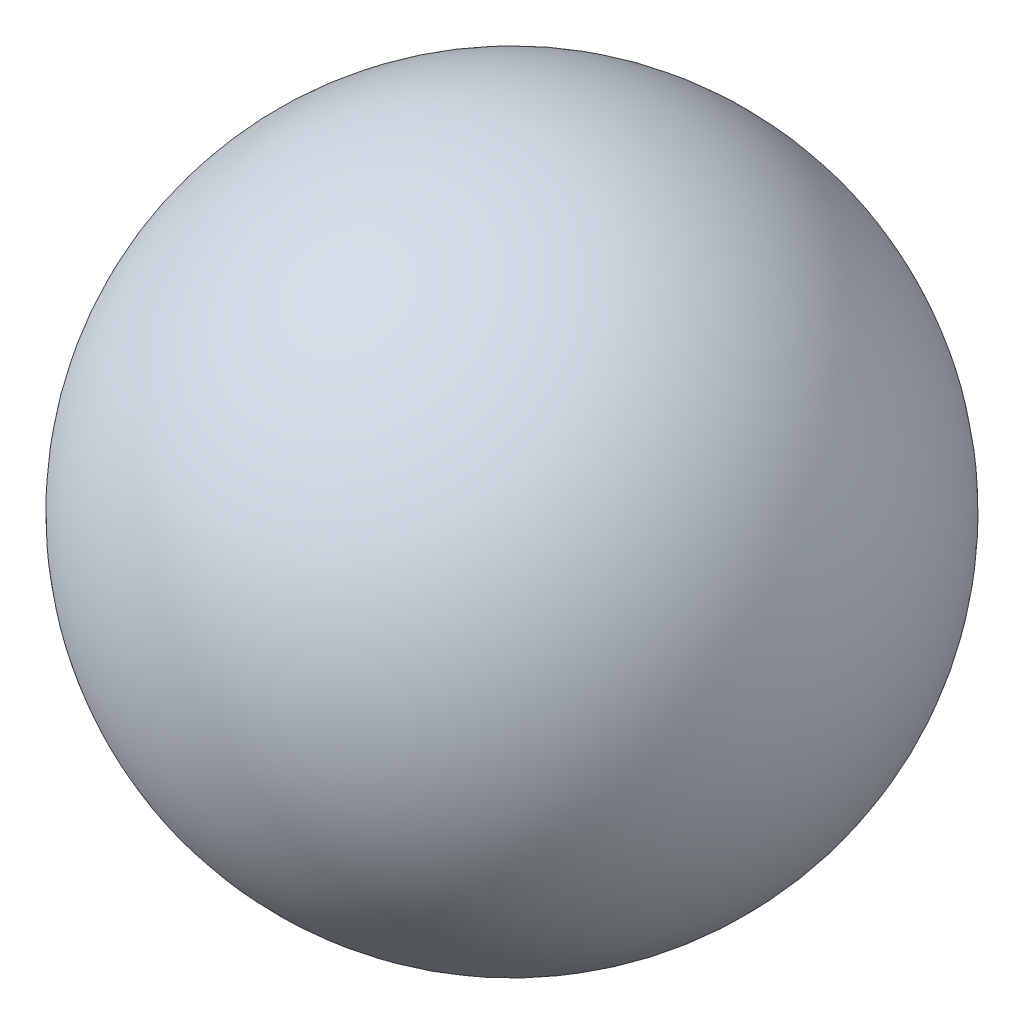
ISO-10303-21;
HEADER;
FILE_DESCRIPTION(('STEP AP214'),'2;1');
FILE_NAME('part.step','',(''),(''),'','','');
FILE_SCHEMA(('AUTOMOTIVE_DESIGN { 1 0 10303 214 1 1 1 1 }'));
ENDSEC;
DATA;
#1=APPLICATION_CONTEXT('core data for automotive mechanical design processes');
#2=APPLICATION_PROTOCOL_DEFINITION('international standard','automotive_design',2000,#1);
#3=PRODUCT_CONTEXT('',#1,'mechanical');
#4=PRODUCT('Part','Part','',(#3));
#5=PRODUCT_RELATED_PRODUCT_CATEGORY('part','',(#4));
#6=PRODUCT_DEFINITION_FORMATION('','',#4);
#7=PRODUCT_DEFINITION_CONTEXT('part definition',#1,'design');
#8=PRODUCT_DEFINITION('design','',#6,#7);
#9=PRODUCT_DEFINITION_SHAPE('','',#8);
#10=(LENGTH_UNIT() NAMED_UNIT(*) SI_UNIT(.MILLI.,.METRE.));
#11=(NAMED_UNIT(*) PLANE_ANGLE_UNIT() SI_UNIT($,.RADIAN.));
#12=(NAMED_UNIT(*) SI_UNIT($,.STERADIAN.) SOLID_ANGLE_UNIT());
#13=UNCERTAINTY_MEASURE_WITH_UNIT(LENGTH_MEASURE(1.E-05),#10,'distance_accuracy_value','');
#14=(GEOMETRIC_REPRESENTATION_CONTEXT(3) GLOBAL_UNCERTAINTY_ASSIGNED_CONTEXT((#13)) GLOBAL_UNIT_ASSIGNED_CONTEXT((#10,
#11,#12)) REPRESENTATION_CONTEXT('',''));
#15=CARTESIAN_POINT('',(0.,0.,0.));
#16=DIRECTION('',(0.,0.,1.));
#17=DIRECTION('',(1.,0.,0.));
#18=AXIS2_PLACEMENT_3D('',#15,#16,#17);
#19=CARTESIAN_POINT('',(0.,0.,0.));
#20=DIRECTION('',(0.,0.,-1.));
#21=DIRECTION('',(1.,0.,0.));
#22=AXIS2_PLACEMENT_3D('',#19,#20,#21);
#23=SPHERICAL_SURFACE('',#22,8.);
#24=CARTESIAN_POINT('',(0.,0.,-8.));
#25=VERTEX_POINT('',#24);
#26=VERTEX_LOOP('',#25);
#27=FACE_BOUND('',#26,.T.);
#28=ADVANCED_FACE('F26',(#27),#23,.T.);
#29=CLOSED_SHELL('',(#28));
#30=MANIFOLD_SOLID_BREP('B2',#29);
#31=ADVANCED_BREP_SHAPE_REPRESENTATION('',(#18,#30),#14);
#32=SHAPE_DEFINITION_REPRESENTATION(#9,#31);
ENDSEC;
END-ISO-10303-21;
